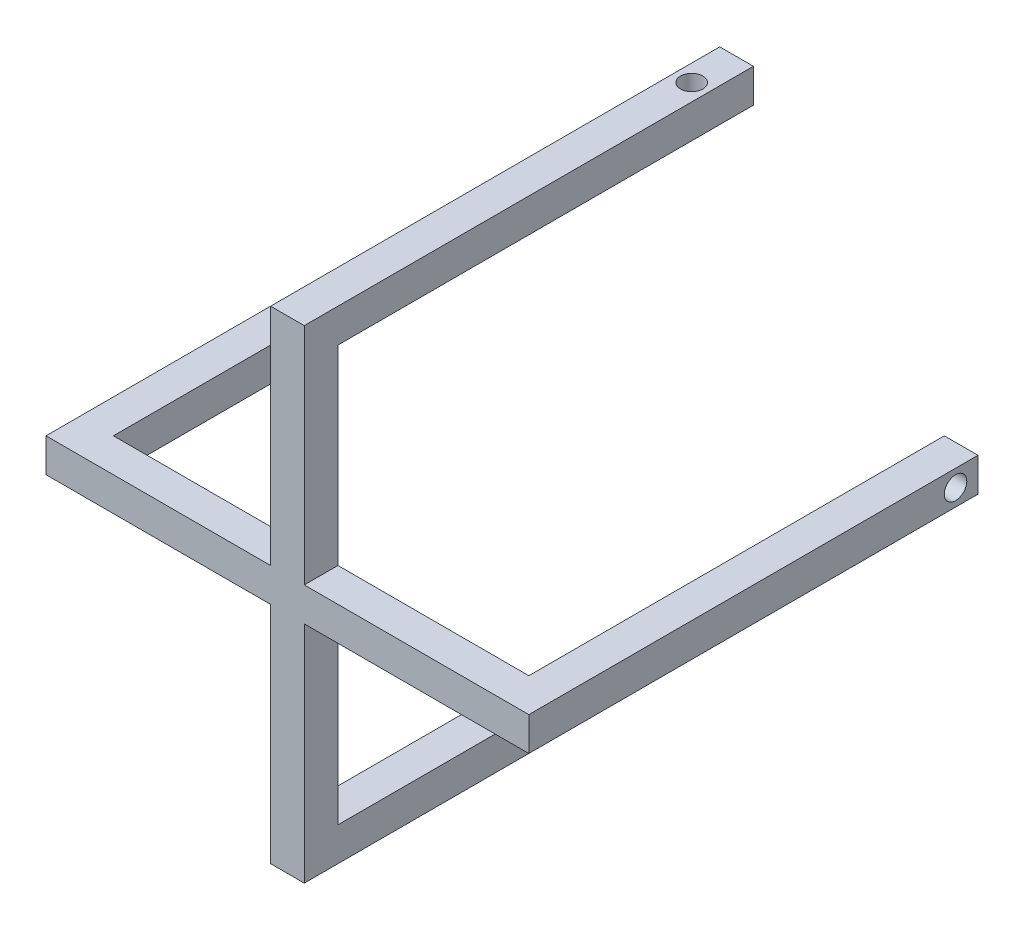
ISO-10303-21;
HEADER;
FILE_DESCRIPTION(('STEP AP214'),'2;1');
FILE_NAME('part.step','',(''),(''),'','','');
FILE_SCHEMA(('AUTOMOTIVE_DESIGN { 1 0 10303 214 1 1 1 1 }'));
ENDSEC;
DATA;
#1=APPLICATION_CONTEXT('core data for automotive mechanical design processes');
#2=APPLICATION_PROTOCOL_DEFINITION('international standard','automotive_design',2000,#1);
#3=PRODUCT_CONTEXT('',#1,'mechanical');
#4=PRODUCT('Part','Part','',(#3));
#5=PRODUCT_RELATED_PRODUCT_CATEGORY('part','',(#4));
#6=PRODUCT_DEFINITION_FORMATION('','',#4);
#7=PRODUCT_DEFINITION_CONTEXT('part definition',#1,'design');
#8=PRODUCT_DEFINITION('design','',#6,#7);
#9=PRODUCT_DEFINITION_SHAPE('','',#8);
#10=(LENGTH_UNIT() NAMED_UNIT(*) SI_UNIT(.MILLI.,.METRE.));
#11=(NAMED_UNIT(*) PLANE_ANGLE_UNIT() SI_UNIT($,.RADIAN.));
#12=(NAMED_UNIT(*) SI_UNIT($,.STERADIAN.) SOLID_ANGLE_UNIT());
#13=UNCERTAINTY_MEASURE_WITH_UNIT(LENGTH_MEASURE(1.E-05),#10,'distance_accuracy_value','');
#14=(GEOMETRIC_REPRESENTATION_CONTEXT(3) GLOBAL_UNCERTAINTY_ASSIGNED_CONTEXT((#13)) GLOBAL_UNIT_ASSIGNED_CONTEXT((#10,
#11,#12)) REPRESENTATION_CONTEXT('',''));
#15=CARTESIAN_POINT('',(0.,0.,0.));
#16=DIRECTION('',(0.,0.,1.));
#17=DIRECTION('',(1.,0.,0.));
#18=AXIS2_PLACEMENT_3D('',#15,#16,#17);
#19=CARTESIAN_POINT('',(0.,7.49999999999999,200.));
#20=DIRECTION('',(0.,-1.,0.));
#21=DIRECTION('',(1.,0.,0.));
#22=AXIS2_PLACEMENT_3D('',#19,#20,#21);
#23=PLANE('',#22);
#24=DIRECTION('',(0.,0.,-1.));
#25=VECTOR('',#24,1.);
#26=CARTESIAN_POINT('',(7.5,7.49999999999991,200.));
#27=LINE('',#26,#25);
#28=CARTESIAN_POINT('',(7.5,7.50000000000111,200.));
#29=VERTEX_POINT('',#28);
#30=CARTESIAN_POINT('',(7.5000000000001,7.49999999999991,185.));
#31=VERTEX_POINT('',#30);
#32=EDGE_CURVE('E255',#29,#31,#27,.T.);
#33=ORIENTED_EDGE('',*,*,#32,.F.);
#34=DIRECTION('',(-1.,0.,0.));
#35=VECTOR('',#34,1.);
#36=CARTESIAN_POINT('',(0.,7.49999999999999,200.));
#37=LINE('',#36,#35);
#38=CARTESIAN_POINT('',(107.5,7.49999999999962,200.));
#39=VERTEX_POINT('',#38);
#40=EDGE_CURVE('E305',#39,#29,#37,.T.);
#41=ORIENTED_EDGE('',*,*,#40,.F.);
#42=DIRECTION('',(0.,0.,1.));
#43=VECTOR('',#42,1.);
#44=CARTESIAN_POINT('',(107.5,7.49999999999962,200.));
#45=LINE('',#44,#43);
#46=CARTESIAN_POINT('',(107.5,7.49999999999962,0.));
#47=VERTEX_POINT('',#46);
#48=EDGE_CURVE('E279',#47,#39,#45,.T.);
#49=ORIENTED_EDGE('',*,*,#48,.F.);
#50=DIRECTION('',(1.,0.,0.));
#51=VECTOR('',#50,1.);
#52=CARTESIAN_POINT('',(92.5,7.49999999999967,0.));
#53=LINE('',#52,#51);
#54=CARTESIAN_POINT('',(92.5,7.49999999999967,0.));
#55=VERTEX_POINT('',#54);
#56=EDGE_CURVE('E275',#55,#47,#53,.T.);
#57=ORIENTED_EDGE('',*,*,#56,.F.);
#58=DIRECTION('',(0.,0.,-1.));
#59=VECTOR('',#58,1.);
#60=CARTESIAN_POINT('',(92.5,7.49999999999967,200.));
#61=LINE('',#60,#59);
#62=CARTESIAN_POINT('',(92.5,7.49999999999967,185.));
#63=VERTEX_POINT('',#62);
#64=EDGE_CURVE('E262',#63,#55,#61,.T.);
#65=ORIENTED_EDGE('',*,*,#64,.F.);
#66=DIRECTION('',(1.,0.,0.));
#67=VECTOR('',#66,1.);
#68=CARTESIAN_POINT('',(-128.713203435596,7.5000000000005,185.));
#69=LINE('',#68,#67);
#70=EDGE_CURVE('E291',#31,#63,#69,.T.);
#71=ORIENTED_EDGE('',*,*,#70,.F.);
#72=EDGE_LOOP('',(#33,#41,#49,#57,#65,#71));
#73=FACE_BOUND('',#72,.T.);
#74=ADVANCED_FACE('F35',(#73),#23,.F.);
#75=CARTESIAN_POINT('',(0.,-7.50000000000001,200.));
#76=DIRECTION('',(0.,-1.,0.));
#77=DIRECTION('',(1.,0.,0.));
#78=AXIS2_PLACEMENT_3D('',#75,#76,#77);
#79=PLANE('',#78);
#80=DIRECTION('',(-1.,0.,0.));
#81=VECTOR('',#80,1.);
#82=CARTESIAN_POINT('',(0.,-7.50000000000001,200.));
#83=LINE('',#82,#81);
#84=CARTESIAN_POINT('',(107.5,-7.50000000000038,200.));
#85=VERTEX_POINT('',#84);
#86=CARTESIAN_POINT('',(7.5,-7.50000000000009,200.));
#87=VERTEX_POINT('',#86);
#88=EDGE_CURVE('E314',#85,#87,#83,.T.);
#89=ORIENTED_EDGE('',*,*,#88,.T.);
#90=DIRECTION('',(0.,0.,-1.));
#91=VECTOR('',#90,1.);
#92=CARTESIAN_POINT('',(7.5,-7.50000000000009,200.));
#93=LINE('',#92,#91);
#94=CARTESIAN_POINT('',(7.50000000000001,-7.50000000000001,185.));
#95=VERTEX_POINT('',#94);
#96=EDGE_CURVE('E51',#87,#95,#93,.T.);
#97=ORIENTED_EDGE('',*,*,#96,.T.);
#98=DIRECTION('',(1.,0.,0.));
#99=VECTOR('',#98,1.);
#100=CARTESIAN_POINT('',(-128.713203435596,-7.4999999999995,185.));
#101=LINE('',#100,#99);
#102=CARTESIAN_POINT('',(92.5,-7.50000000000032,185.));
#103=VERTEX_POINT('',#102);
#104=EDGE_CURVE('E282',#95,#103,#101,.T.);
#105=ORIENTED_EDGE('',*,*,#104,.T.);
#106=DIRECTION('',(0.,0.,-1.));
#107=VECTOR('',#106,1.);
#108=CARTESIAN_POINT('',(92.5,-7.50000000000032,200.));
#109=LINE('',#108,#107);
#110=CARTESIAN_POINT('',(92.5,-7.50000000000032,0.));
#111=VERTEX_POINT('',#110);
#112=EDGE_CURVE('E263',#103,#111,#109,.T.);
#113=ORIENTED_EDGE('',*,*,#112,.T.);
#114=DIRECTION('',(1.,0.,0.));
#115=VECTOR('',#114,1.);
#116=CARTESIAN_POINT('',(92.5,-7.50000000000032,0.));
#117=LINE('',#116,#115);
#118=CARTESIAN_POINT('',(107.5,-7.50000000000038,0.));
#119=VERTEX_POINT('',#118);
#120=EDGE_CURVE('E269',#111,#119,#117,.T.);
#121=ORIENTED_EDGE('',*,*,#120,.T.);
#122=DIRECTION('',(0.,0.,-1.));
#123=VECTOR('',#122,1.);
#124=CARTESIAN_POINT('',(107.5,-7.50000000000038,200.));
#125=LINE('',#124,#123);
#126=EDGE_CURVE('E283',#85,#119,#125,.T.);
#127=ORIENTED_EDGE('',*,*,#126,.F.);
#128=EDGE_LOOP('',(#89,#97,#105,#113,#121,#127));
#129=FACE_BOUND('',#128,.T.);
#130=ADVANCED_FACE('F377',(#129),#79,.T.);
#131=CARTESIAN_POINT('',(-128.713203435596,7.5000000000005,185.));
#132=DIRECTION('',(0.,0.,-1.));
#133=DIRECTION('',(-1.,0.,0.));
#134=AXIS2_PLACEMENT_3D('',#131,#132,#133);
#135=PLANE('',#134);
#136=CARTESIAN_POINT('',(-92.4999999999999,7.50000000000036,185.));
#137=VERTEX_POINT('',#136);
#138=CARTESIAN_POINT('',(-7.4999999999999,7.50000000000006,185.));
#139=VERTEX_POINT('',#138);
#140=EDGE_CURVE('E287',#137,#139,#69,.T.);
#141=ORIENTED_EDGE('',*,*,#140,.T.);
#142=DIRECTION('',(0.,-1.,0.));
#143=VECTOR('',#142,1.);
#144=CARTESIAN_POINT('',(-7.49999999999901,128.713203435597,185.));
#145=LINE('',#144,#143);
#146=CARTESIAN_POINT('',(-7.49999999999927,92.5,185.));
#147=VERTEX_POINT('',#146);
#148=EDGE_CURVE('E218',#147,#139,#145,.T.);
#149=ORIENTED_EDGE('',*,*,#148,.F.);
#150=DIRECTION('',(-1.,0.,0.));
#151=VECTOR('',#150,1.);
#152=CARTESIAN_POINT('',(0.,92.5,185.));
#153=LINE('',#152,#151);
#154=CARTESIAN_POINT('',(7.5,92.5,185.));
#155=VERTEX_POINT('',#154);
#156=EDGE_CURVE('E216',#155,#147,#153,.T.);
#157=ORIENTED_EDGE('',*,*,#156,.F.);
#158=DIRECTION('',(0.,-1.,0.));
#159=VECTOR('',#158,1.);
#160=CARTESIAN_POINT('',(7.500000000001,128.713203435596,185.));
#161=LINE('',#160,#159);
#162=EDGE_CURVE('E213',#155,#31,#161,.T.);
#163=ORIENTED_EDGE('',*,*,#162,.T.);
#164=ORIENTED_EDGE('',*,*,#70,.T.);
#165=DIRECTION('',(0.,-1.,0.));
#166=VECTOR('',#165,1.);
#167=CARTESIAN_POINT('',(92.5,7.49999999999968,185.));
#168=LINE('',#167,#166);
#169=EDGE_CURVE('E11',#63,#103,#168,.T.);
#170=ORIENTED_EDGE('',*,*,#169,.T.);
#171=ORIENTED_EDGE('',*,*,#104,.F.);
#172=CARTESIAN_POINT('',(7.49999999999935,-92.5000000000001,185.));
#173=VERTEX_POINT('',#172);
#174=EDGE_CURVE('E217',#95,#173,#161,.T.);
#175=ORIENTED_EDGE('',*,*,#174,.T.);
#176=DIRECTION('',(-1.,0.,0.));
#177=VECTOR('',#176,1.);
#178=CARTESIAN_POINT('',(7.49999999999936,-92.5000000000001,185.));
#179=LINE('',#178,#177);
#180=CARTESIAN_POINT('',(-7.50000000000064,-92.5,185.));
#181=VERTEX_POINT('',#180);
#182=EDGE_CURVE('E252',#173,#181,#179,.T.);
#183=ORIENTED_EDGE('',*,*,#182,.T.);
#184=CARTESIAN_POINT('',(-7.49999999999999,-7.49999999999995,185.));
#185=VERTEX_POINT('',#184);
#186=EDGE_CURVE('E183',#185,#181,#145,.T.);
#187=ORIENTED_EDGE('',*,*,#186,.F.);
#188=CARTESIAN_POINT('',(-92.5,-7.49999999999964,185.));
#189=VERTEX_POINT('',#188);
#190=EDGE_CURVE('E59',#189,#185,#101,.T.);
#191=ORIENTED_EDGE('',*,*,#190,.F.);
#192=DIRECTION('',(0.,-1.,0.));
#193=VECTOR('',#192,1.);
#194=CARTESIAN_POINT('',(-92.5,1.02695629777827E-12,185.));
#195=LINE('',#194,#193);
#196=EDGE_CURVE('E44',#137,#189,#195,.T.);
#197=ORIENTED_EDGE('',*,*,#196,.F.);
#198=EDGE_LOOP('',(#141,#149,#157,#163,#164,#170,#171,#175,#183,#187,#191,#197));
#199=FACE_BOUND('',#198,.T.);
#200=ADVANCED_FACE('F341',(#199),#135,.T.);
#201=CARTESIAN_POINT('',(-7.5,7.50000000000007,200.));
#202=VERTEX_POINT('',#201);
#203=CARTESIAN_POINT('',(-107.5,7.50000000000111,200.));
#204=VERTEX_POINT('',#203);
#205=EDGE_CURVE('E319',#202,#204,#37,.T.);
#206=ORIENTED_EDGE('',*,*,#205,.F.);
#207=DIRECTION('',(0.,0.,-1.));
#208=VECTOR('',#207,1.);
#209=CARTESIAN_POINT('',(-7.5,7.50000000000007,200.));
#210=LINE('',#209,#208);
#211=EDGE_CURVE('E259',#202,#139,#210,.T.);
#212=ORIENTED_EDGE('',*,*,#211,.T.);
#213=ORIENTED_EDGE('',*,*,#140,.F.);
#214=DIRECTION('',(0.,0.,-1.));
#215=VECTOR('',#214,1.);
#216=CARTESIAN_POINT('',(-92.4999999999999,7.50000000000096,200.));
#217=LINE('',#216,#215);
#218=CARTESIAN_POINT('',(-92.4999999999999,7.50000000000096,0.));
#219=VERTEX_POINT('',#218);
#220=EDGE_CURVE('E298',#137,#219,#217,.T.);
#221=ORIENTED_EDGE('',*,*,#220,.T.);
#222=DIRECTION('',(-1.,0.,0.));
#223=VECTOR('',#222,1.);
#224=CARTESIAN_POINT('',(0.,7.49999999999999,0.));
#225=LINE('',#224,#223);
#226=CARTESIAN_POINT('',(-107.5,7.50000000000111,0.));
#227=VERTEX_POINT('',#226);
#228=EDGE_CURVE('E311',#219,#227,#225,.T.);
#229=ORIENTED_EDGE('',*,*,#228,.T.);
#230=DIRECTION('',(0.,0.,-1.));
#231=VECTOR('',#230,1.);
#232=CARTESIAN_POINT('',(-107.5,7.50000000000111,200.));
#233=LINE('',#232,#231);
#234=EDGE_CURVE('E290',#204,#227,#233,.T.);
#235=ORIENTED_EDGE('',*,*,#234,.F.);
#236=EDGE_LOOP('',(#206,#212,#213,#221,#229,#235));
#237=FACE_BOUND('',#236,.T.);
#238=ADVANCED_FACE('F339',(#237),#23,.F.);
#239=CARTESIAN_POINT('',(-107.5,1.19348975147204E-12,200.));
#240=DIRECTION('',(-1.,0.,0.));
#241=DIRECTION('',(0.,-1.,0.));
#242=AXIS2_PLACEMENT_3D('',#239,#240,#241);
#243=PLANE('',#242);
#244=CARTESIAN_POINT('',(-107.5,3.9782991715735E-13,10.));
#245=DIRECTION('',(1.,0.,0.));
#246=DIRECTION('',(0.,1.,0.));
#247=AXIS2_PLACEMENT_3D('',#244,#245,#246);
#248=CIRCLE('',#247,5.);
#249=CARTESIAN_POINT('',(-107.5,5.0000000000004,10.));
#250=VERTEX_POINT('',#249);
#251=EDGE_CURVE('E389',#250,#250,#248,.T.);
#252=ORIENTED_EDGE('',*,*,#251,.T.);
#253=EDGE_LOOP('',(#252));
#254=FACE_BOUND('',#253,.T.);
#255=DIRECTION('',(0.,1.,0.));
#256=VECTOR('',#255,1.);
#257=CARTESIAN_POINT('',(-107.5,1.19348975147204E-12,0.));
#258=LINE('',#257,#256);
#259=CARTESIAN_POINT('',(-107.5,-7.49999999999889,0.));
#260=VERTEX_POINT('',#259);
#261=EDGE_CURVE('E308',#260,#227,#258,.T.);
#262=ORIENTED_EDGE('',*,*,#261,.F.);
#263=DIRECTION('',(0.,0.,-1.));
#264=VECTOR('',#263,1.);
#265=CARTESIAN_POINT('',(-107.5,-7.49999999999889,200.));
#266=LINE('',#265,#264);
#267=CARTESIAN_POINT('',(-107.5,-7.49999999999889,200.));
#268=VERTEX_POINT('',#267);
#269=EDGE_CURVE('E294',#268,#260,#266,.T.);
#270=ORIENTED_EDGE('',*,*,#269,.F.);
#271=DIRECTION('',(0.,1.,0.));
#272=VECTOR('',#271,1.);
#273=CARTESIAN_POINT('',(-107.5,1.19348975147204E-12,200.));
#274=LINE('',#273,#272);
#275=EDGE_CURVE('E316',#268,#204,#274,.T.);
#276=ORIENTED_EDGE('',*,*,#275,.T.);
#277=ORIENTED_EDGE('',*,*,#234,.T.);
#278=EDGE_LOOP('',(#262,#270,#276,#277));
#279=FACE_BOUND('',#278,.T.);
#280=ADVANCED_FACE('F432',(#254,#279),#243,.T.);
#281=DIRECTION('',(0.,0.,-1.));
#282=VECTOR('',#281,1.);
#283=CARTESIAN_POINT('',(-7.5,-7.49999999999993,200.));
#284=LINE('',#283,#282);
#285=CARTESIAN_POINT('',(-7.5,-7.50000000000038,200.));
#286=VERTEX_POINT('',#285);
#287=EDGE_CURVE('E257',#286,#185,#284,.T.);
#288=ORIENTED_EDGE('',*,*,#287,.F.);
#289=EDGE_CURVE('E300',#286,#268,#83,.T.);
#290=ORIENTED_EDGE('',*,*,#289,.T.);
#291=ORIENTED_EDGE('',*,*,#269,.T.);
#292=DIRECTION('',(-1.,0.,0.));
#293=VECTOR('',#292,1.);
#294=CARTESIAN_POINT('',(0.,-7.50000000000001,0.));
#295=LINE('',#294,#293);
#296=CARTESIAN_POINT('',(-92.5000000000001,-7.49999999999904,0.));
#297=VERTEX_POINT('',#296);
#298=EDGE_CURVE('E304',#297,#260,#295,.T.);
#299=ORIENTED_EDGE('',*,*,#298,.F.);
#300=DIRECTION('',(0.,0.,-1.));
#301=VECTOR('',#300,1.);
#302=CARTESIAN_POINT('',(-92.5000000000001,-7.49999999999904,200.));
#303=LINE('',#302,#301);
#304=EDGE_CURVE('E296',#189,#297,#303,.T.);
#305=ORIENTED_EDGE('',*,*,#304,.F.);
#306=ORIENTED_EDGE('',*,*,#190,.T.);
#307=EDGE_LOOP('',(#288,#290,#291,#299,#305,#306));
#308=FACE_BOUND('',#307,.T.);
#309=ADVANCED_FACE('F330',(#308),#79,.T.);
#310=CARTESIAN_POINT('',(-92.5,1.02695629777827E-12,200.));
#311=DIRECTION('',(-1.,0.,0.));
#312=DIRECTION('',(0.,-1.,0.));
#313=AXIS2_PLACEMENT_3D('',#310,#311,#312);
#314=PLANE('',#313);
#315=CARTESIAN_POINT('',(-92.5,3.4231876592609E-13,10.));
#316=DIRECTION('',(-1.,0.,0.));
#317=DIRECTION('',(0.,-1.,0.));
#318=AXIS2_PLACEMENT_3D('',#315,#316,#317);
#319=CIRCLE('',#318,5.);
#320=CARTESIAN_POINT('',(-92.5,-4.99999999999966,10.));
#321=VERTEX_POINT('',#320);
#322=EDGE_CURVE('E381',#321,#321,#319,.T.);
#323=ORIENTED_EDGE('',*,*,#322,.T.);
#324=EDGE_LOOP('',(#323));
#325=FACE_BOUND('',#324,.T.);
#326=ORIENTED_EDGE('',*,*,#220,.F.);
#327=ORIENTED_EDGE('',*,*,#196,.T.);
#328=ORIENTED_EDGE('',*,*,#304,.T.);
#329=DIRECTION('',(0.,1.,0.));
#330=VECTOR('',#329,1.);
#331=CARTESIAN_POINT('',(-92.5,1.02695629777827E-12,0.));
#332=LINE('',#331,#330);
#333=EDGE_CURVE('E301',#297,#219,#332,.T.);
#334=ORIENTED_EDGE('',*,*,#333,.T.);
#335=EDGE_LOOP('',(#326,#327,#328,#334));
#336=FACE_BOUND('',#335,.T.);
#337=ADVANCED_FACE('F325',(#325,#336),#314,.F.);
#338=CARTESIAN_POINT('',(0.,0.,200.));
#339=DIRECTION('',(0.,0.,1.));
#340=DIRECTION('',(1.,0.,0.));
#341=AXIS2_PLACEMENT_3D('',#338,#339,#340);
#342=PLANE('',#341);
#343=ORIENTED_EDGE('',*,*,#289,.F.);
#344=DIRECTION('',(0.,1.,0.));
#345=VECTOR('',#344,1.);
#346=CARTESIAN_POINT('',(-7.5,0.,200.));
#347=LINE('',#346,#345);
#348=CARTESIAN_POINT('',(-7.50000000000075,-107.5,200.));
#349=VERTEX_POINT('',#348);
#350=EDGE_CURVE('E223',#349,#286,#347,.T.);
#351=ORIENTED_EDGE('',*,*,#350,.F.);
#352=DIRECTION('',(-1.,0.,0.));
#353=VECTOR('',#352,1.);
#354=CARTESIAN_POINT('',(7.49999999999925,-107.5,200.));
#355=LINE('',#354,#353);
#356=CARTESIAN_POINT('',(7.49999999999925,-107.5,200.));
#357=VERTEX_POINT('',#356);
#358=EDGE_CURVE('E204',#357,#349,#355,.T.);
#359=ORIENTED_EDGE('',*,*,#358,.F.);
#360=DIRECTION('',(0.,1.,0.));
#361=VECTOR('',#360,1.);
#362=CARTESIAN_POINT('',(7.5,0.,200.));
#363=LINE('',#362,#361);
#364=EDGE_CURVE('E227',#357,#87,#363,.T.);
#365=ORIENTED_EDGE('',*,*,#364,.T.);
#366=ORIENTED_EDGE('',*,*,#88,.F.);
#367=DIRECTION('',(0.,-1.,0.));
#368=VECTOR('',#367,1.);
#369=CARTESIAN_POINT('',(107.5,7.49999999999962,200.));
#370=LINE('',#369,#368);
#371=EDGE_CURVE('E278',#39,#85,#370,.T.);
#372=ORIENTED_EDGE('',*,*,#371,.F.);
#373=ORIENTED_EDGE('',*,*,#40,.T.);
#374=CARTESIAN_POINT('',(7.5,107.5,200.));
#375=VERTEX_POINT('',#374);
#376=EDGE_CURVE('E225',#29,#375,#363,.T.);
#377=ORIENTED_EDGE('',*,*,#376,.T.);
#378=DIRECTION('',(1.,0.,0.));
#379=VECTOR('',#378,1.);
#380=CARTESIAN_POINT('',(0.,107.5,200.));
#381=LINE('',#380,#379);
#382=CARTESIAN_POINT('',(-7.5,107.5,200.));
#383=VERTEX_POINT('',#382);
#384=EDGE_CURVE('E230',#383,#375,#381,.T.);
#385=ORIENTED_EDGE('',*,*,#384,.F.);
#386=EDGE_CURVE('E226',#202,#383,#347,.T.);
#387=ORIENTED_EDGE('',*,*,#386,.F.);
#388=ORIENTED_EDGE('',*,*,#205,.T.);
#389=ORIENTED_EDGE('',*,*,#275,.F.);
#390=EDGE_LOOP('',(#343,#351,#359,#365,#366,#372,#373,#377,#385,#387,#388,#389));
#391=FACE_BOUND('',#390,.T.);
#392=ADVANCED_FACE('F37',(#391),#342,.T.);
#393=CARTESIAN_POINT('',(0.,0.,0.));
#394=DIRECTION('',(0.,0.,1.));
#395=DIRECTION('',(1.,0.,0.));
#396=AXIS2_PLACEMENT_3D('',#393,#394,#395);
#397=PLANE('',#396);
#398=ORIENTED_EDGE('',*,*,#228,.F.);
#399=ORIENTED_EDGE('',*,*,#333,.F.);
#400=ORIENTED_EDGE('',*,*,#298,.T.);
#401=ORIENTED_EDGE('',*,*,#261,.T.);
#402=EDGE_LOOP('',(#398,#399,#400,#401));
#403=FACE_BOUND('',#402,.T.);
#404=ADVANCED_FACE('F335',(#403),#397,.F.);
#405=CARTESIAN_POINT('',(107.5,-3.97829917157348E-13,0.));
#406=DIRECTION('',(1.,0.,0.));
#407=DIRECTION('',(0.,1.,0.));
#408=AXIS2_PLACEMENT_3D('',#405,#406,#407);
#409=PLANE('',#408);
#410=CARTESIAN_POINT('',(107.5,-3.97829917157348E-13,10.));
#411=DIRECTION('',(1.,0.,0.));
#412=DIRECTION('',(0.,1.,0.));
#413=AXIS2_PLACEMENT_3D('',#410,#411,#412);
#414=CIRCLE('',#413,5.);
#415=CARTESIAN_POINT('',(107.5,4.9999999999996,10.));
#416=VERTEX_POINT('',#415);
#417=EDGE_CURVE('E386',#416,#416,#414,.T.);
#418=ORIENTED_EDGE('',*,*,#417,.F.);
#419=EDGE_LOOP('',(#418));
#420=FACE_BOUND('',#419,.T.);
#421=ORIENTED_EDGE('',*,*,#371,.T.);
#422=ORIENTED_EDGE('',*,*,#126,.T.);
#423=DIRECTION('',(0.,-1.,0.));
#424=VECTOR('',#423,1.);
#425=CARTESIAN_POINT('',(107.5,7.49999999999962,0.));
#426=LINE('',#425,#424);
#427=EDGE_CURVE('E272',#47,#119,#426,.T.);
#428=ORIENTED_EDGE('',*,*,#427,.F.);
#429=ORIENTED_EDGE('',*,*,#48,.T.);
#430=EDGE_LOOP('',(#421,#422,#428,#429));
#431=FACE_BOUND('',#430,.T.);
#432=ADVANCED_FACE('F441',(#420,#431),#409,.T.);
#433=CARTESIAN_POINT('',(92.5,7.49999999999967,200.));
#434=DIRECTION('',(1.,0.,0.));
#435=DIRECTION('',(0.,1.,0.));
#436=AXIS2_PLACEMENT_3D('',#433,#434,#435);
#437=PLANE('',#436);
#438=CARTESIAN_POINT('',(92.5,-3.4231876592609E-13,10.));
#439=DIRECTION('',(1.,0.,0.));
#440=DIRECTION('',(0.,1.,0.));
#441=AXIS2_PLACEMENT_3D('',#438,#439,#440);
#442=CIRCLE('',#441,5.);
#443=CARTESIAN_POINT('',(92.5,4.99999999999966,10.));
#444=VERTEX_POINT('',#443);
#445=EDGE_CURVE('E39',#444,#444,#442,.T.);
#446=ORIENTED_EDGE('',*,*,#445,.T.);
#447=EDGE_LOOP('',(#446));
#448=FACE_BOUND('',#447,.T.);
#449=ORIENTED_EDGE('',*,*,#169,.F.);
#450=ORIENTED_EDGE('',*,*,#64,.T.);
#451=DIRECTION('',(0.,-1.,0.));
#452=VECTOR('',#451,1.);
#453=CARTESIAN_POINT('',(92.5,7.49999999999967,0.));
#454=LINE('',#453,#452);
#455=EDGE_CURVE('E265',#55,#111,#454,.T.);
#456=ORIENTED_EDGE('',*,*,#455,.T.);
#457=ORIENTED_EDGE('',*,*,#112,.F.);
#458=EDGE_LOOP('',(#449,#450,#456,#457));
#459=FACE_BOUND('',#458,.T.);
#460=ADVANCED_FACE('F370',(#448,#459),#437,.F.);
#461=CARTESIAN_POINT('',(0.,0.,0.));
#462=DIRECTION('',(0.,0.,-1.));
#463=DIRECTION('',(-1.,0.,0.));
#464=AXIS2_PLACEMENT_3D('',#461,#462,#463);
#465=PLANE('',#464);
#466=ORIENTED_EDGE('',*,*,#56,.T.);
#467=ORIENTED_EDGE('',*,*,#427,.T.);
#468=ORIENTED_EDGE('',*,*,#120,.F.);
#469=ORIENTED_EDGE('',*,*,#455,.F.);
#470=EDGE_LOOP('',(#466,#467,#468,#469));
#471=FACE_BOUND('',#470,.T.);
#472=ADVANCED_FACE('F374',(#471),#465,.T.);
#473=CARTESIAN_POINT('',(-6.8463753185218E-13,-92.5,200.));
#474=DIRECTION('',(0.,-1.,0.));
#475=DIRECTION('',(1.,0.,0.));
#476=AXIS2_PLACEMENT_3D('',#473,#474,#475);
#477=PLANE('',#476);
#478=CARTESIAN_POINT('',(-6.8463753185218E-13,-92.5,20.));
#479=DIRECTION('',(0.,-1.,0.));
#480=DIRECTION('',(1.,0.,0.));
#481=AXIS2_PLACEMENT_3D('',#478,#479,#480);
#482=CIRCLE('',#481,5.);
#483=CARTESIAN_POINT('',(4.99999999999932,-92.5000000000001,20.));
#484=VERTEX_POINT('',#483);
#485=EDGE_CURVE('E390',#484,#484,#482,.T.);
#486=ORIENTED_EDGE('',*,*,#485,.T.);
#487=EDGE_LOOP('',(#486));
#488=FACE_BOUND('',#487,.T.);
#489=ORIENTED_EDGE('',*,*,#182,.F.);
#490=DIRECTION('',(0.,0.,-1.));
#491=VECTOR('',#490,1.);
#492=CARTESIAN_POINT('',(7.49999999999935,-92.5000000000001,200.));
#493=LINE('',#492,#491);
#494=CARTESIAN_POINT('',(7.49999999999935,-92.5000000000001,0.));
#495=VERTEX_POINT('',#494);
#496=EDGE_CURVE('E188',#173,#495,#493,.T.);
#497=ORIENTED_EDGE('',*,*,#496,.T.);
#498=DIRECTION('',(-1.,0.,0.));
#499=VECTOR('',#498,1.);
#500=CARTESIAN_POINT('',(-6.8463753185218E-13,-92.5,0.));
#501=LINE('',#500,#499);
#502=CARTESIAN_POINT('',(-7.50000000000065,-92.4999999999999,0.));
#503=VERTEX_POINT('',#502);
#504=EDGE_CURVE('E187',#495,#503,#501,.T.);
#505=ORIENTED_EDGE('',*,*,#504,.T.);
#506=DIRECTION('',(0.,0.,-1.));
#507=VECTOR('',#506,1.);
#508=CARTESIAN_POINT('',(-7.50000000000065,-92.4999999999999,200.));
#509=LINE('',#508,#507);
#510=EDGE_CURVE('E174',#181,#503,#509,.T.);
#511=ORIENTED_EDGE('',*,*,#510,.F.);
#512=EDGE_LOOP('',(#489,#497,#505,#511));
#513=FACE_BOUND('',#512,.T.);
#514=ADVANCED_FACE('F191',(#488,#513),#477,.F.);
#515=CARTESIAN_POINT('',(0.,0.,0.));
#516=DIRECTION('',(0.,0.,1.));
#517=DIRECTION('',(1.,0.,0.));
#518=AXIS2_PLACEMENT_3D('',#515,#516,#517);
#519=PLANE('',#518);
#520=DIRECTION('',(0.,-1.,0.));
#521=VECTOR('',#520,1.);
#522=CARTESIAN_POINT('',(-7.50000000000001,0.,0.));
#523=LINE('',#522,#521);
#524=CARTESIAN_POINT('',(-7.50000000000075,-107.5,0.));
#525=VERTEX_POINT('',#524);
#526=EDGE_CURVE('E180',#503,#525,#523,.T.);
#527=ORIENTED_EDGE('',*,*,#526,.F.);
#528=ORIENTED_EDGE('',*,*,#504,.F.);
#529=DIRECTION('',(0.,-1.,0.));
#530=VECTOR('',#529,1.);
#531=CARTESIAN_POINT('',(7.49999999999999,0.,0.));
#532=LINE('',#531,#530);
#533=CARTESIAN_POINT('',(7.49999999999925,-107.5,0.));
#534=VERTEX_POINT('',#533);
#535=EDGE_CURVE('E196',#495,#534,#532,.T.);
#536=ORIENTED_EDGE('',*,*,#535,.T.);
#537=DIRECTION('',(-1.,0.,0.));
#538=VECTOR('',#537,1.);
#539=CARTESIAN_POINT('',(-7.95659834314696E-13,-107.5,0.));
#540=LINE('',#539,#538);
#541=EDGE_CURVE('E200',#534,#525,#540,.T.);
#542=ORIENTED_EDGE('',*,*,#541,.T.);
#543=EDGE_LOOP('',(#527,#528,#536,#542));
#544=FACE_BOUND('',#543,.T.);
#545=ADVANCED_FACE('F198',(#544),#519,.F.);
#546=CARTESIAN_POINT('',(-7.95659834314696E-13,-107.5,0.));
#547=DIRECTION('',(0.,1.,0.));
#548=DIRECTION('',(-1.,0.,0.));
#549=AXIS2_PLACEMENT_3D('',#546,#547,#548);
#550=PLANE('',#549);
#551=CARTESIAN_POINT('',(-7.95659834314696E-13,-107.5,20.));
#552=DIRECTION('',(0.,-1.,0.));
#553=DIRECTION('',(1.,0.,0.));
#554=AXIS2_PLACEMENT_3D('',#551,#552,#553);
#555=CIRCLE('',#554,5.);
#556=CARTESIAN_POINT('',(4.99999999999921,-107.5,20.));
#557=VERTEX_POINT('',#556);
#558=EDGE_CURVE('E399',#557,#557,#555,.T.);
#559=ORIENTED_EDGE('',*,*,#558,.F.);
#560=EDGE_LOOP('',(#559));
#561=FACE_BOUND('',#560,.T.);
#562=DIRECTION('',(0.,0.,1.));
#563=VECTOR('',#562,1.);
#564=CARTESIAN_POINT('',(7.49999999999925,-107.5,200.));
#565=LINE('',#564,#563);
#566=EDGE_CURVE('E201',#534,#357,#565,.T.);
#567=ORIENTED_EDGE('',*,*,#566,.T.);
#568=ORIENTED_EDGE('',*,*,#358,.T.);
#569=DIRECTION('',(0.,0.,-1.));
#570=VECTOR('',#569,1.);
#571=CARTESIAN_POINT('',(-7.50000000000075,-107.5,200.));
#572=LINE('',#571,#570);
#573=EDGE_CURVE('E209',#349,#525,#572,.T.);
#574=ORIENTED_EDGE('',*,*,#573,.T.);
#575=ORIENTED_EDGE('',*,*,#541,.F.);
#576=EDGE_LOOP('',(#567,#568,#574,#575));
#577=FACE_BOUND('',#576,.T.);
#578=ADVANCED_FACE('F454',(#561,#577),#550,.F.);
#579=CARTESIAN_POINT('',(7.5,0.,200.));
#580=DIRECTION('',(-1.,0.,0.));
#581=DIRECTION('',(0.,0.,1.));
#582=AXIS2_PLACEMENT_3D('',#579,#580,#581);
#583=PLANE('',#582);
#584=ORIENTED_EDGE('',*,*,#96,.F.);
#585=ORIENTED_EDGE('',*,*,#364,.F.);
#586=ORIENTED_EDGE('',*,*,#566,.F.);
#587=ORIENTED_EDGE('',*,*,#535,.F.);
#588=ORIENTED_EDGE('',*,*,#496,.F.);
#589=ORIENTED_EDGE('',*,*,#174,.F.);
#590=EDGE_LOOP('',(#584,#585,#586,#587,#588,#589));
#591=FACE_BOUND('',#590,.T.);
#592=ADVANCED_FACE('F380',(#591),#583,.F.);
#593=CARTESIAN_POINT('',(-7.5,0.,200.));
#594=DIRECTION('',(-1.,0.,0.));
#595=DIRECTION('',(0.,0.,1.));
#596=AXIS2_PLACEMENT_3D('',#593,#594,#595);
#597=PLANE('',#596);
#598=ORIENTED_EDGE('',*,*,#350,.T.);
#599=ORIENTED_EDGE('',*,*,#287,.T.);
#600=ORIENTED_EDGE('',*,*,#186,.T.);
#601=ORIENTED_EDGE('',*,*,#510,.T.);
#602=ORIENTED_EDGE('',*,*,#526,.T.);
#603=ORIENTED_EDGE('',*,*,#573,.F.);
#604=EDGE_LOOP('',(#598,#599,#600,#601,#602,#603));
#605=FACE_BOUND('',#604,.T.);
#606=ADVANCED_FACE('F177',(#605),#597,.T.);
#607=ORIENTED_EDGE('',*,*,#211,.F.);
#608=ORIENTED_EDGE('',*,*,#386,.T.);
#609=DIRECTION('',(0.,0.,-1.));
#610=VECTOR('',#609,1.);
#611=CARTESIAN_POINT('',(-7.5,107.5,200.));
#612=LINE('',#611,#610);
#613=CARTESIAN_POINT('',(-7.5,107.5,0.));
#614=VERTEX_POINT('',#613);
#615=EDGE_CURVE('E233',#383,#614,#612,.T.);
#616=ORIENTED_EDGE('',*,*,#615,.T.);
#617=DIRECTION('',(0.,1.,0.));
#618=VECTOR('',#617,1.);
#619=CARTESIAN_POINT('',(-7.5,0.,0.));
#620=LINE('',#619,#618);
#621=CARTESIAN_POINT('',(-7.5,92.5,0.));
#622=VERTEX_POINT('',#621);
#623=EDGE_CURVE('E222',#622,#614,#620,.T.);
#624=ORIENTED_EDGE('',*,*,#623,.F.);
#625=DIRECTION('',(0.,0.,-1.));
#626=VECTOR('',#625,1.);
#627=CARTESIAN_POINT('',(-7.5,92.5,200.));
#628=LINE('',#627,#626);
#629=EDGE_CURVE('E250',#147,#622,#628,.T.);
#630=ORIENTED_EDGE('',*,*,#629,.F.);
#631=ORIENTED_EDGE('',*,*,#148,.T.);
#632=EDGE_LOOP('',(#607,#608,#616,#624,#630,#631));
#633=FACE_BOUND('',#632,.T.);
#634=ADVANCED_FACE('F350',(#633),#597,.T.);
#635=ORIENTED_EDGE('',*,*,#376,.F.);
#636=ORIENTED_EDGE('',*,*,#32,.T.);
#637=ORIENTED_EDGE('',*,*,#162,.F.);
#638=DIRECTION('',(0.,0.,-1.));
#639=VECTOR('',#638,1.);
#640=CARTESIAN_POINT('',(7.5,92.5,200.));
#641=LINE('',#640,#639);
#642=CARTESIAN_POINT('',(7.5,92.5,0.));
#643=VERTEX_POINT('',#642);
#644=EDGE_CURVE('E248',#155,#643,#641,.T.);
#645=ORIENTED_EDGE('',*,*,#644,.T.);
#646=DIRECTION('',(0.,1.,0.));
#647=VECTOR('',#646,1.);
#648=CARTESIAN_POINT('',(7.5,0.,0.));
#649=LINE('',#648,#647);
#650=CARTESIAN_POINT('',(7.5,107.5,0.));
#651=VERTEX_POINT('',#650);
#652=EDGE_CURVE('E239',#643,#651,#649,.T.);
#653=ORIENTED_EDGE('',*,*,#652,.T.);
#654=DIRECTION('',(0.,0.,-1.));
#655=VECTOR('',#654,1.);
#656=CARTESIAN_POINT('',(7.5,107.5,200.));
#657=LINE('',#656,#655);
#658=EDGE_CURVE('E246',#375,#651,#657,.T.);
#659=ORIENTED_EDGE('',*,*,#658,.F.);
#660=EDGE_LOOP('',(#635,#636,#637,#645,#653,#659));
#661=FACE_BOUND('',#660,.T.);
#662=ADVANCED_FACE('F361',(#661),#583,.F.);
#663=CARTESIAN_POINT('',(0.,92.5,200.));
#664=DIRECTION('',(0.,1.,0.));
#665=DIRECTION('',(0.,0.,1.));
#666=AXIS2_PLACEMENT_3D('',#663,#664,#665);
#667=PLANE('',#666);
#668=CARTESIAN_POINT('',(6.8463753185218E-13,92.5,20.));
#669=DIRECTION('',(0.,1.,0.));
#670=DIRECTION('',(0.,0.,1.));
#671=AXIS2_PLACEMENT_3D('',#668,#669,#670);
#672=CIRCLE('',#671,5.);
#673=CARTESIAN_POINT('',(6.8463753185218E-13,92.5,25.));
#674=VERTEX_POINT('',#673);
#675=EDGE_CURVE('E395',#674,#674,#672,.T.);
#676=ORIENTED_EDGE('',*,*,#675,.T.);
#677=EDGE_LOOP('',(#676));
#678=FACE_BOUND('',#677,.T.);
#679=ORIENTED_EDGE('',*,*,#644,.F.);
#680=ORIENTED_EDGE('',*,*,#156,.T.);
#681=ORIENTED_EDGE('',*,*,#629,.T.);
#682=DIRECTION('',(1.,0.,0.));
#683=VECTOR('',#682,1.);
#684=CARTESIAN_POINT('',(0.,92.5,0.));
#685=LINE('',#684,#683);
#686=EDGE_CURVE('E236',#622,#643,#685,.T.);
#687=ORIENTED_EDGE('',*,*,#686,.T.);
#688=EDGE_LOOP('',(#679,#680,#681,#687));
#689=FACE_BOUND('',#688,.T.);
#690=ADVANCED_FACE('F347',(#678,#689),#667,.F.);
#691=CARTESIAN_POINT('',(0.,107.5,200.));
#692=DIRECTION('',(0.,1.,0.));
#693=DIRECTION('',(0.,0.,1.));
#694=AXIS2_PLACEMENT_3D('',#691,#692,#693);
#695=PLANE('',#694);
#696=CARTESIAN_POINT('',(7.95659834314701E-13,107.500000000001,20.));
#697=DIRECTION('',(0.,-1.,0.));
#698=DIRECTION('',(1.,0.,0.));
#699=AXIS2_PLACEMENT_3D('',#696,#697,#698);
#700=CIRCLE('',#699,5.);
#701=CARTESIAN_POINT('',(5.0000000000008,107.500000000001,20.));
#702=VERTEX_POINT('',#701);
#703=EDGE_CURVE('E398',#702,#702,#700,.T.);
#704=ORIENTED_EDGE('',*,*,#703,.T.);
#705=EDGE_LOOP('',(#704));
#706=FACE_BOUND('',#705,.T.);
#707=DIRECTION('',(1.,0.,0.));
#708=VECTOR('',#707,1.);
#709=CARTESIAN_POINT('',(0.,107.5,0.));
#710=LINE('',#709,#708);
#711=EDGE_CURVE('E242',#614,#651,#710,.T.);
#712=ORIENTED_EDGE('',*,*,#711,.F.);
#713=ORIENTED_EDGE('',*,*,#615,.F.);
#714=ORIENTED_EDGE('',*,*,#384,.T.);
#715=ORIENTED_EDGE('',*,*,#658,.T.);
#716=EDGE_LOOP('',(#712,#713,#714,#715));
#717=FACE_BOUND('',#716,.T.);
#718=ADVANCED_FACE('F357',(#706,#717),#695,.T.);
#719=CARTESIAN_POINT('',(0.,0.,0.));
#720=DIRECTION('',(0.,0.,1.));
#721=DIRECTION('',(1.,0.,0.));
#722=AXIS2_PLACEMENT_3D('',#719,#720,#721);
#723=PLANE('',#722);
#724=ORIENTED_EDGE('',*,*,#623,.T.);
#725=ORIENTED_EDGE('',*,*,#711,.T.);
#726=ORIENTED_EDGE('',*,*,#652,.F.);
#727=ORIENTED_EDGE('',*,*,#686,.F.);
#728=EDGE_LOOP('',(#724,#725,#726,#727));
#729=FACE_BOUND('',#728,.T.);
#730=ADVANCED_FACE('F354',(#729),#723,.F.);
#731=CARTESIAN_POINT('',(-107.5,3.9782991715735E-13,10.));
#732=DIRECTION('',(1.,0.,0.));
#733=DIRECTION('',(0.,1.,0.));
#734=AXIS2_PLACEMENT_3D('',#731,#732,#733);
#735=CYLINDRICAL_SURFACE('',#734,5.);
#736=ORIENTED_EDGE('',*,*,#417,.T.);
#737=EDGE_LOOP('',(#736));
#738=FACE_BOUND('',#737,.T.);
#739=ORIENTED_EDGE('',*,*,#445,.F.);
#740=EDGE_LOOP('',(#739));
#741=FACE_BOUND('',#740,.T.);
#742=ADVANCED_FACE('F462',(#738,#741),#735,.F.);
#743=ORIENTED_EDGE('',*,*,#251,.F.);
#744=EDGE_LOOP('',(#743));
#745=FACE_BOUND('',#744,.T.);
#746=ORIENTED_EDGE('',*,*,#322,.F.);
#747=EDGE_LOOP('',(#746));
#748=FACE_BOUND('',#747,.T.);
#749=ADVANCED_FACE('F410',(#745,#748),#735,.F.);
#750=CARTESIAN_POINT('',(7.95659834314701E-13,107.500000000001,20.));
#751=DIRECTION('',(0.,-1.,0.));
#752=DIRECTION('',(1.,0.,0.));
#753=AXIS2_PLACEMENT_3D('',#750,#751,#752);
#754=CYLINDRICAL_SURFACE('',#753,5.);
#755=ORIENTED_EDGE('',*,*,#703,.F.);
#756=EDGE_LOOP('',(#755));
#757=FACE_BOUND('',#756,.T.);
#758=ORIENTED_EDGE('',*,*,#675,.F.);
#759=EDGE_LOOP('',(#758));
#760=FACE_BOUND('',#759,.T.);
#761=ADVANCED_FACE('F406',(#757,#760),#754,.F.);
#762=ORIENTED_EDGE('',*,*,#558,.T.);
#763=EDGE_LOOP('',(#762));
#764=FACE_BOUND('',#763,.T.);
#765=ORIENTED_EDGE('',*,*,#485,.F.);
#766=EDGE_LOOP('',(#765));
#767=FACE_BOUND('',#766,.T.);
#768=ADVANCED_FACE('F409',(#764,#767),#754,.F.);
#769=CLOSED_SHELL('',(#74,#130,#200,#238,#280,#309,#337,#392,#404,#432,#460,#472,#514,#545,#578,
#592,#606,#634,#662,#690,#718,#730,#742,#749,#761,#768));
#770=MANIFOLD_SOLID_BREP('B2',#769);
#771=ADVANCED_BREP_SHAPE_REPRESENTATION('',(#18,#770),#14);
#772=SHAPE_DEFINITION_REPRESENTATION(#9,#771);
ENDSEC;
END-ISO-10303-21;
